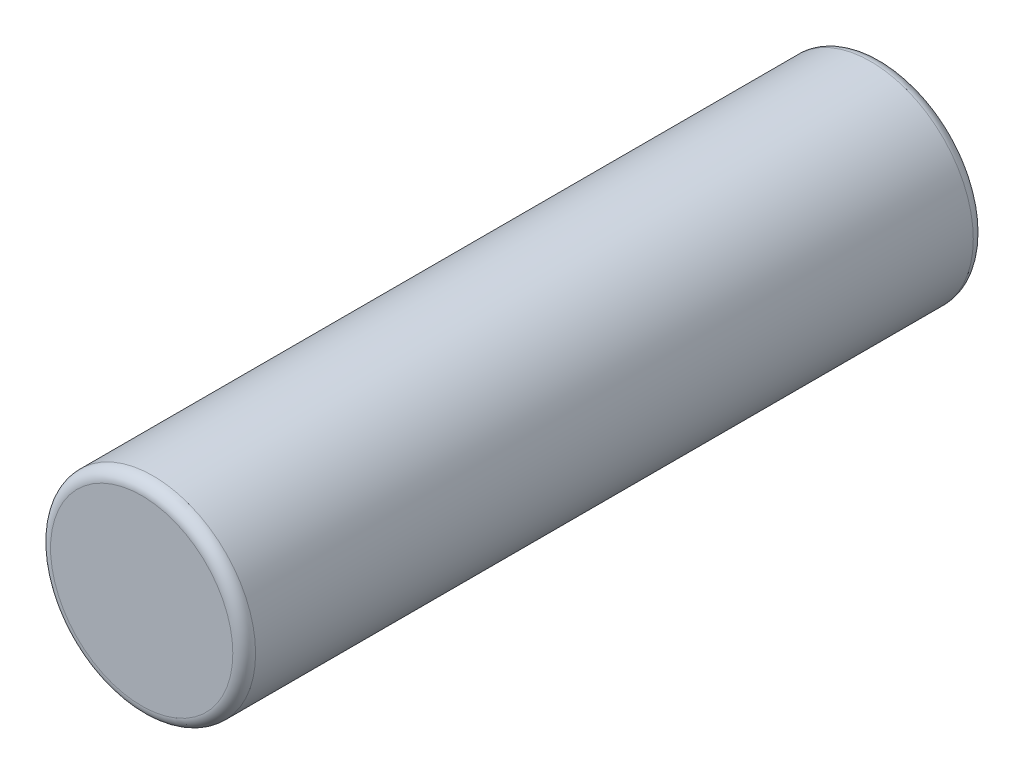
ISO-10303-21;
HEADER;
FILE_DESCRIPTION(('STEP AP214'),'2;1');
FILE_NAME('part.step','',(''),(''),'','','');
FILE_SCHEMA(('AUTOMOTIVE_DESIGN { 1 0 10303 214 1 1 1 1 }'));
ENDSEC;
DATA;
#1=APPLICATION_CONTEXT('core data for automotive mechanical design processes');
#2=APPLICATION_PROTOCOL_DEFINITION('international standard','automotive_design',2000,#1);
#3=PRODUCT_CONTEXT('',#1,'mechanical');
#4=PRODUCT('Part','Part','',(#3));
#5=PRODUCT_RELATED_PRODUCT_CATEGORY('part','',(#4));
#6=PRODUCT_DEFINITION_FORMATION('','',#4);
#7=PRODUCT_DEFINITION_CONTEXT('part definition',#1,'design');
#8=PRODUCT_DEFINITION('design','',#6,#7);
#9=PRODUCT_DEFINITION_SHAPE('','',#8);
#10=(LENGTH_UNIT() NAMED_UNIT(*) SI_UNIT(.MILLI.,.METRE.));
#11=(NAMED_UNIT(*) PLANE_ANGLE_UNIT() SI_UNIT($,.RADIAN.));
#12=(NAMED_UNIT(*) SI_UNIT($,.STERADIAN.) SOLID_ANGLE_UNIT());
#13=UNCERTAINTY_MEASURE_WITH_UNIT(LENGTH_MEASURE(1.E-05),#10,'distance_accuracy_value','');
#14=(GEOMETRIC_REPRESENTATION_CONTEXT(3) GLOBAL_UNCERTAINTY_ASSIGNED_CONTEXT((#13)) GLOBAL_UNIT_ASSIGNED_CONTEXT((#10,
#11,#12)) REPRESENTATION_CONTEXT('',''));
#15=CARTESIAN_POINT('',(0.,0.,0.));
#16=DIRECTION('',(0.,0.,1.));
#17=DIRECTION('',(1.,0.,0.));
#18=AXIS2_PLACEMENT_3D('',#15,#16,#17);
#19=CARTESIAN_POINT('',(0.,0.,32.5));
#20=DIRECTION('',(0.,0.,-1.));
#21=DIRECTION('',(-1.,0.,0.));
#22=AXIS2_PLACEMENT_3D('',#19,#20,#21);
#23=CYLINDRICAL_SURFACE('',#22,9.);
#24=CARTESIAN_POINT('',(0.,0.,31.5));
#25=DIRECTION('',(0.,0.,1.));
#26=DIRECTION('',(1.,0.,0.));
#27=AXIS2_PLACEMENT_3D('',#24,#25,#26);
#28=CIRCLE('',#27,9.);
#29=CARTESIAN_POINT('',(9.,0.,31.5));
#30=VERTEX_POINT('',#29);
#31=EDGE_CURVE('E43',#30,#30,#28,.F.);
#32=ORIENTED_EDGE('',*,*,#31,.T.);
#33=EDGE_LOOP('',(#32));
#34=FACE_BOUND('',#33,.T.);
#35=CARTESIAN_POINT('',(0.,0.,-31.5));
#36=DIRECTION('',(0.,0.,1.));
#37=DIRECTION('',(1.,0.,0.));
#38=AXIS2_PLACEMENT_3D('',#35,#36,#37);
#39=CIRCLE('',#38,9.);
#40=CARTESIAN_POINT('',(9.,0.,-31.5));
#41=VERTEX_POINT('',#40);
#42=EDGE_CURVE('E47',#41,#41,#39,.T.);
#43=ORIENTED_EDGE('',*,*,#42,.T.);
#44=EDGE_LOOP('',(#43));
#45=FACE_BOUND('',#44,.T.);
#46=ADVANCED_FACE('F36',(#34,#45),#23,.T.);
#47=CARTESIAN_POINT('',(0.,0.,32.5));
#48=DIRECTION('',(0.,0.,1.));
#49=DIRECTION('',(1.,0.,0.));
#50=AXIS2_PLACEMENT_3D('',#47,#48,#49);
#51=PLANE('',#50);
#52=CARTESIAN_POINT('',(0.,0.,32.5));
#53=DIRECTION('',(0.,0.,1.));
#54=DIRECTION('',(1.,0.,0.));
#55=AXIS2_PLACEMENT_3D('',#52,#53,#54);
#56=CIRCLE('',#55,8.);
#57=CARTESIAN_POINT('',(8.,0.,32.5));
#58=VERTEX_POINT('',#57);
#59=EDGE_CURVE('E51',#58,#58,#56,.T.);
#60=ORIENTED_EDGE('',*,*,#59,.T.);
#61=EDGE_LOOP('',(#60));
#62=FACE_BOUND('',#61,.T.);
#63=ADVANCED_FACE('F57',(#62),#51,.T.);
#64=CARTESIAN_POINT('',(0.,0.,-32.5));
#65=DIRECTION('',(0.,0.,1.));
#66=DIRECTION('',(1.,0.,0.));
#67=AXIS2_PLACEMENT_3D('',#64,#65,#66);
#68=PLANE('',#67);
#69=CARTESIAN_POINT('',(0.,0.,-32.5));
#70=DIRECTION('',(0.,0.,1.));
#71=DIRECTION('',(1.,0.,0.));
#72=AXIS2_PLACEMENT_3D('',#69,#70,#71);
#73=CIRCLE('',#72,8.);
#74=CARTESIAN_POINT('',(8.,0.,-32.5));
#75=VERTEX_POINT('',#74);
#76=EDGE_CURVE('E10',#75,#75,#73,.F.);
#77=ORIENTED_EDGE('',*,*,#76,.T.);
#78=EDGE_LOOP('',(#77));
#79=FACE_BOUND('',#78,.T.);
#80=ADVANCED_FACE('F61',(#79),#68,.F.);
#81=CARTESIAN_POINT('',(0.,0.,31.5));
#82=DIRECTION('',(0.,0.,1.));
#83=DIRECTION('',(1.,0.,0.));
#84=AXIS2_PLACEMENT_3D('',#81,#82,#83);
#85=TOROIDAL_SURFACE('',#84,8.,1.);
#86=ORIENTED_EDGE('',*,*,#31,.F.);
#87=EDGE_LOOP('',(#86));
#88=FACE_BOUND('',#87,.T.);
#89=ORIENTED_EDGE('',*,*,#59,.F.);
#90=EDGE_LOOP('',(#89));
#91=FACE_BOUND('',#90,.T.);
#92=ADVANCED_FACE('F59',(#88,#91),#85,.T.);
#93=CARTESIAN_POINT('',(0.,0.,-31.5));
#94=DIRECTION('',(0.,0.,1.));
#95=DIRECTION('',(1.,0.,0.));
#96=AXIS2_PLACEMENT_3D('',#93,#94,#95);
#97=TOROIDAL_SURFACE('',#96,8.,1.);
#98=ORIENTED_EDGE('',*,*,#76,.F.);
#99=EDGE_LOOP('',(#98));
#100=FACE_BOUND('',#99,.T.);
#101=ORIENTED_EDGE('',*,*,#42,.F.);
#102=EDGE_LOOP('',(#101));
#103=FACE_BOUND('',#102,.T.);
#104=ADVANCED_FACE('F38',(#100,#103),#97,.T.);
#105=CLOSED_SHELL('',(#46,#63,#80,#92,#104));
#106=MANIFOLD_SOLID_BREP('B2',#105);
#107=ADVANCED_BREP_SHAPE_REPRESENTATION('',(#18,#106),#14);
#108=SHAPE_DEFINITION_REPRESENTATION(#9,#107);
ENDSEC;
END-ISO-10303-21;
